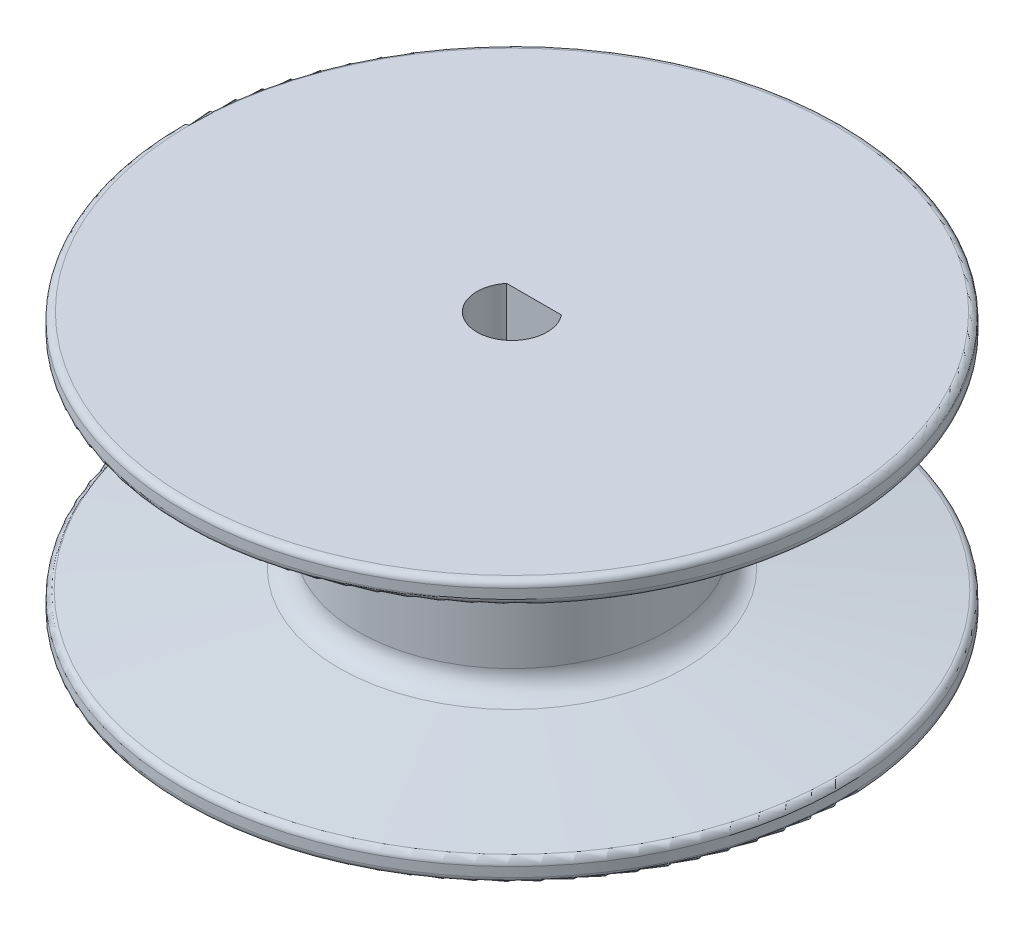
ISO-10303-21;
HEADER;
FILE_DESCRIPTION(('STEP AP214'),'2;1');
FILE_NAME('part.step','',(''),(''),'','','');
FILE_SCHEMA(('AUTOMOTIVE_DESIGN { 1 0 10303 214 1 1 1 1 }'));
ENDSEC;
DATA;
#1=APPLICATION_CONTEXT('core data for automotive mechanical design processes');
#2=APPLICATION_PROTOCOL_DEFINITION('international standard','automotive_design',2000,#1);
#3=PRODUCT_CONTEXT('',#1,'mechanical');
#4=PRODUCT('Part','Part','',(#3));
#5=PRODUCT_RELATED_PRODUCT_CATEGORY('part','',(#4));
#6=PRODUCT_DEFINITION_FORMATION('','',#4);
#7=PRODUCT_DEFINITION_CONTEXT('part definition',#1,'design');
#8=PRODUCT_DEFINITION('design','',#6,#7);
#9=PRODUCT_DEFINITION_SHAPE('','',#8);
#10=(LENGTH_UNIT() NAMED_UNIT(*) SI_UNIT(.MILLI.,.METRE.));
#11=(NAMED_UNIT(*) PLANE_ANGLE_UNIT() SI_UNIT($,.RADIAN.));
#12=(NAMED_UNIT(*) SI_UNIT($,.STERADIAN.) SOLID_ANGLE_UNIT());
#13=UNCERTAINTY_MEASURE_WITH_UNIT(LENGTH_MEASURE(1.E-05),#10,'distance_accuracy_value','');
#14=(GEOMETRIC_REPRESENTATION_CONTEXT(3) GLOBAL_UNCERTAINTY_ASSIGNED_CONTEXT((#13)) GLOBAL_UNIT_ASSIGNED_CONTEXT((#10,
#11,#12)) REPRESENTATION_CONTEXT('',''));
#15=CARTESIAN_POINT('',(0.,0.,0.));
#16=DIRECTION('',(0.,0.,1.));
#17=DIRECTION('',(1.,0.,0.));
#18=AXIS2_PLACEMENT_3D('',#15,#16,#17);
#19=CARTESIAN_POINT('',(0.,-6.,0.));
#20=DIRECTION('',(0.,-1.,0.));
#21=DIRECTION('',(0.,0.,-1.));
#22=AXIS2_PLACEMENT_3D('',#19,#20,#21);
#23=CYLINDRICAL_SURFACE('',#22,7.);
#24=CARTESIAN_POINT('',(0.,-2.88278221853732,0.));
#25=DIRECTION('',(0.,-1.,0.));
#26=DIRECTION('',(0.,0.,-1.));
#27=AXIS2_PLACEMENT_3D('',#24,#25,#26);
#28=CIRCLE('',#27,7.);
#29=CARTESIAN_POINT('',(0.,-2.88278221853732,-7.));
#30=VERTEX_POINT('',#29);
#31=EDGE_CURVE('E240',#30,#30,#28,.T.);
#32=ORIENTED_EDGE('',*,*,#31,.T.);
#33=EDGE_LOOP('',(#32));
#34=FACE_BOUND('',#33,.T.);
#35=CARTESIAN_POINT('',(0.,-9.11721778146268,0.));
#36=DIRECTION('',(0.,-1.,0.));
#37=DIRECTION('',(0.,0.,-1.));
#38=AXIS2_PLACEMENT_3D('',#35,#36,#37);
#39=CIRCLE('',#38,7.);
#40=CARTESIAN_POINT('',(0.,-9.11721778146268,-7.));
#41=VERTEX_POINT('',#40);
#42=EDGE_CURVE('E237',#41,#41,#39,.F.);
#43=ORIENTED_EDGE('',*,*,#42,.T.);
#44=EDGE_LOOP('',(#43));
#45=FACE_BOUND('',#44,.T.);
#46=CARTESIAN_POINT('',(0.,-4.25,-7.));
#47=CARTESIAN_POINT('',(0.0966887701146863,-4.25000271336119,-6.99999836512681));
#48=CARTESIAN_POINT('',(0.193407850802557,-4.25804014256942,-6.99797674487133));
#49=CARTESIAN_POINT('',(0.384074044398955,-4.28992934319151,-6.99010799468208));
#50=CARTESIAN_POINT('',(0.478019554682529,-4.31379007779416,-6.9842586965663));
#51=CARTESIAN_POINT('',(0.660357684213007,-4.37651246237244,-6.96938230720713));
#52=CARTESIAN_POINT('',(0.748756824001671,-4.41535609850116,-6.96035903315768));
#53=CARTESIAN_POINT('',(0.917784153888498,-4.50687828838564,-6.94009567775525));
#54=CARTESIAN_POINT('',(0.998412081740219,-4.55955730880543,-6.92885552163059));
#55=CARTESIAN_POINT('',(1.15126891518441,-4.67840092126325,-6.90511982523768));
#56=CARTESIAN_POINT('',(1.22331497173792,-4.74479683745238,-6.89260491673288));
#57=CARTESIAN_POINT('',(1.35537374840386,-4.8886942390604,-6.86785890137118));
#58=CARTESIAN_POINT('',(1.41538510977399,-4.96619697677091,-6.8556278266974));
#59=CARTESIAN_POINT('',(1.52253096659887,-5.13152776452701,-6.83263904982995));
#60=CARTESIAN_POINT('',(1.56946091857958,-5.21949210261214,-6.82190593549039));
#61=CARTESIAN_POINT('',(1.64779639330895,-5.40237314693475,-6.80341077280927));
#62=CARTESIAN_POINT('',(1.67920439801255,-5.49728873888006,-6.79564824951587));
#63=CARTESIAN_POINT('',(1.72498064293834,-5.68936741456955,-6.78417222837143));
#64=CARTESIAN_POINT('',(1.73967764638889,-5.78644737872477,-6.7803807292133));
#65=CARTESIAN_POINT('',(1.75263873757916,-5.98176333051631,-6.77704256294031));
#66=CARTESIAN_POINT('',(1.75090549878764,-6.07999912748171,-6.77749520523418));
#67=CARTESIAN_POINT('',(1.73131761207916,-6.27231844236856,-6.78252406412721));
#68=CARTESIAN_POINT('',(1.71385473022227,-6.36644489170928,-6.78700006835526));
#69=CARTESIAN_POINT('',(1.66392821805362,-6.55038789272984,-6.79941161289231));
#70=CARTESIAN_POINT('',(1.63146351908099,-6.64020413686715,-6.80734739965812));
#71=CARTESIAN_POINT('',(1.55212105759335,-6.81402768562741,-6.82587632888218));
#72=CARTESIAN_POINT('',(1.50510111177173,-6.89796720042115,-6.83649548714325));
#73=CARTESIAN_POINT('',(1.39808232201745,-7.05690516138298,-6.8591799598745));
#74=CARTESIAN_POINT('',(1.33808120694365,-7.1319020394118,-6.87124552723858));
#75=CARTESIAN_POINT('',(1.20477399546142,-7.2730708849768,-6.89588527296411));
#76=CARTESIAN_POINT('',(1.1311373011935,-7.33893023840491,-6.90846414390966));
#77=CARTESIAN_POINT('',(0.973713903754316,-7.45742478287456,-6.9324029317525));
#78=CARTESIAN_POINT('',(0.889926890659267,-7.51005956997416,-6.94376281140984));
#79=CARTESIAN_POINT('',(0.714135203461623,-7.60072568392845,-6.96404020776546));
#80=CARTESIAN_POINT('',(0.622103292076727,-7.63870623029683,-6.97294920149013));
#81=CARTESIAN_POINT('',(0.432688676166696,-7.6985701899945,-6.98725903156655));
#82=CARTESIAN_POINT('',(0.335306999008898,-7.72045668248783,-6.99266053895828));
#83=CARTESIAN_POINT('',(0.140629965455031,-7.74703382648531,-6.99924749149937));
#84=CARTESIAN_POINT('',(0.0433961733195777,-7.75215019708785,-7.00053729092992));
#85=CARTESIAN_POINT('',(-0.150538353935093,-7.74620949760193,-6.99905272283526));
#86=CARTESIAN_POINT('',(-0.247239136252028,-7.73515388340101,-6.99627872115488));
#87=CARTESIAN_POINT('',(-0.435883313572574,-7.69753394021006,-6.9870451131525));
#88=CARTESIAN_POINT('',(-0.527875972130214,-7.67120185927685,-6.9806407321678));
#89=CARTESIAN_POINT('',(-0.706133507861263,-7.60404173530015,-6.96486824406489));
#90=CARTESIAN_POINT('',(-0.792397805538074,-7.5632122283013,-6.95549983764874));
#91=CARTESIAN_POINT('',(-0.958443656834822,-7.46739118297948,-6.93458859247362));
#92=CARTESIAN_POINT('',(-1.03808301547514,-7.41216120220378,-6.92301011928087));
#93=CARTESIAN_POINT('',(-1.18711438258379,-7.2894117730702,-6.89901927385322));
#94=CARTESIAN_POINT('',(-1.25650461880184,-7.22189020378027,-6.88660675793655));
#95=CARTESIAN_POINT('',(-1.38482232941819,-7.07449771234813,-6.86197116454233));
#96=CARTESIAN_POINT('',(-1.44345117889237,-6.99436434649717,-6.84976021551828));
#97=CARTESIAN_POINT('',(-1.54642921884815,-6.82514525979,-6.82725024773445));
#98=CARTESIAN_POINT('',(-1.59077904318426,-6.73605993654695,-6.8169511441153));
#99=CARTESIAN_POINT('',(-1.66360999071084,-6.55194332385141,-6.79954443857109));
#100=CARTESIAN_POINT('',(-1.69218512942974,-6.45695110026532,-6.79241797840556));
#101=CARTESIAN_POINT('',(-1.73290326994608,-6.2633054224627,-6.78214534771881));
#102=CARTESIAN_POINT('',(-1.74504986539177,-6.16465277379543,-6.77899830673259));
#103=CARTESIAN_POINT('',(-1.75237835538966,-5.96952547216893,-6.77710718071283));
#104=CARTESIAN_POINT('',(-1.74803754741014,-5.87306965902115,-6.77823921516307));
#105=CARTESIAN_POINT('',(-1.72360682469834,-5.68231212988736,-6.78449227175816));
#106=CARTESIAN_POINT('',(-1.7035172264679,-5.58801037065074,-6.78961321373833));
#107=CARTESIAN_POINT('',(-1.64841987268326,-5.40475679775702,-6.80319804129843));
#108=CARTESIAN_POINT('',(-1.61350163879377,-5.31577647721976,-6.81164184442361));
#109=CARTESIAN_POINT('',(-1.52980906587258,-5.14487372016736,-6.83092381678967));
#110=CARTESIAN_POINT('',(-1.48103280503989,-5.06295226461526,-6.84176231807568));
#111=CARTESIAN_POINT('',(-1.36951237340999,-4.90618626616431,-6.86496573307431));
#112=CARTESIAN_POINT('',(-1.30643702339763,-4.83158208100538,-6.87736308970383));
#113=CARTESIAN_POINT('',(-1.16875426638802,-4.69386178107202,-6.90209365120667));
#114=CARTESIAN_POINT('',(-1.09414412480467,-4.63074839820154,-6.91442684014903));
#115=CARTESIAN_POINT('',(-0.933878851153021,-4.51668680667463,-6.93790598255607));
#116=CARTESIAN_POINT('',(-0.848048159369117,-4.46597961738316,-6.94902638926846));
#117=CARTESIAN_POINT('',(-0.668810402762221,-4.37979462656938,-6.96855745804305));
#118=CARTESIAN_POINT('',(-0.575408824009529,-4.34430591257671,-6.97697006066411));
#119=CARTESIAN_POINT('',(-0.401811962117383,-4.29483286461541,-6.98889402826465));
#120=CARTESIAN_POINT('',(-0.32244353272608,-4.27805688310433,-6.99303015894806));
#121=CARTESIAN_POINT('',(-0.162057083458997,-4.25563973244107,-6.99858372770606));
#122=CARTESIAN_POINT('',(-0.0810391881163856,-4.24999772581048,-7.00000137026043));
#123=CARTESIAN_POINT('',(0.,-4.25,-7.));
#124=B_SPLINE_CURVE_WITH_KNOTS('',3,(#46,#47,#48,#49,#50,#51,#52,#53,#54,#55,#56,#57,#58,#59,
#60,#61,#62,#63,#64,#65,#66,#67,#68,#69,#70,#71,#72,#73,#74,#75,#76,#77,#78,#79,#80,#81,#82,#83,
#84,#85,#86,#87,#88,#89,#90,#91,#92,#93,#94,#95,#96,#97,#98,#99,#100,#101,#102,#103,#104,#105,
#106,#107,#108,#109,#110,#111,#112,#113,#114,#115,#116,#117,#118,#119,#120,#121,#122,#123),
.UNSPECIFIED.,.T.,.F.,(4,2,2,2,2,2,2,2,2,2,2,2,2,2,2,2,2,2,2,2,2,2,2,2,2,2,2,2,2,2,2,2,2,2,2,2,
2,2,4),(0.,0.289769331217205,0.579702944057883,0.869289052667124,1.15888493019755,
1.45383508009995,1.74881851176739,2.04818422136775,2.34750204697596,2.64082344282669,
2.9340971113148,3.22026246508188,3.50644820710378,3.79552282519526,4.08464805975523,
4.38201751130523,4.67939604484622,4.97779600510633,5.27613885970083,5.56684693774156,
5.85752884631533,6.14390320266377,6.43030648542672,6.72179185492911,7.01332756842689,
7.31201927405222,7.61069771874426,7.90757630383043,8.20438993794476,8.49267743798381,
8.78095914448707,9.06752467319355,9.35412996159718,9.64821172478228,9.9423633139882,
10.2418421641619,10.5411059112491,10.7839928343251,11.0268614871688),.UNSPECIFIED.);
#125=CARTESIAN_POINT('',(0.,-4.25,-7.));
#126=VERTEX_POINT('',#125);
#127=EDGE_CURVE('E142',#126,#126,#124,.T.);
#128=ORIENTED_EDGE('',*,*,#127,.F.);
#129=EDGE_LOOP('',(#128));
#130=FACE_BOUND('',#129,.T.);
#131=ADVANCED_FACE('F38',(#34,#45,#130),#23,.T.);
#132=CARTESIAN_POINT('',(0.,0.,0.));
#133=DIRECTION('',(0.,-1.,0.));
#134=DIRECTION('',(0.,0.,-1.));
#135=AXIS2_PLACEMENT_3D('',#132,#133,#134);
#136=CYLINDRICAL_SURFACE('',#135,1.6);
#137=DIRECTION('',(0.,-1.,0.));
#138=VECTOR('',#137,1.);
#139=CARTESIAN_POINT('',(-1.24899959967968,0.,-1.));
#140=LINE('',#139,#138);
#141=CARTESIAN_POINT('',(-1.24899959967968,-7.22576506721313,-1.));
#142=VERTEX_POINT('',#141);
#143=CARTESIAN_POINT('',(-1.24899959967968,-12.,-1.));
#144=VERTEX_POINT('',#143);
#145=EDGE_CURVE('E223',#142,#144,#140,.T.);
#146=ORIENTED_EDGE('',*,*,#145,.F.);
#147=CARTESIAN_POINT('',(-1.24899959967968,-7.22576506721313,-1.));
#148=CARTESIAN_POINT('',(-1.27872546272438,-7.19548783157617,-0.962842567774063));
#149=CARTESIAN_POINT('',(-1.30665754424261,-7.16480922981224,-0.924590678652687));
#150=CARTESIAN_POINT('',(-1.35881979259119,-7.10350086417033,-0.846067529664403));
#151=CARTESIAN_POINT('',(-1.38307089599479,-7.07287188636127,-0.805809565178594));
#152=CARTESIAN_POINT('',(-1.42811219271172,-7.01213402453972,-0.722997046737295));
#153=CARTESIAN_POINT('',(-1.44890169674681,-6.98202524517699,-0.680442037619729));
#154=CARTESIAN_POINT('',(-1.48704406156153,-6.92328913739691,-0.592437458827899));
#155=CARTESIAN_POINT('',(-1.50437565640621,-6.89467173045152,-0.546972120003896));
#156=CARTESIAN_POINT('',(-1.51986841535707,-6.86746757864487,-0.499999999999999));
#157=B_SPLINE_CURVE_WITH_KNOTS('',3,(#147,#148,#149,#150,#151,#152,#153,#154,#155,#156),
.UNSPECIFIED.,.F.,.F.,(4,2,2,2,4),(0.,0.169146220206672,0.337291086902693,0.505469394890911,
0.674652102447786),.UNSPECIFIED.);
#158=CARTESIAN_POINT('',(-1.51986841535707,-6.86746757864487,-0.499999999999999));
#159=VERTEX_POINT('',#158);
#160=EDGE_CURVE('E105',#142,#159,#157,.T.);
#161=ORIENTED_EDGE('',*,*,#160,.T.);
#162=DIRECTION('',(0.,-1.,0.));
#163=VECTOR('',#162,1.);
#164=CARTESIAN_POINT('',(-1.51986841535707,0.,-0.499999999999999));
#165=LINE('',#164,#163);
#166=CARTESIAN_POINT('',(-1.51986841535707,-5.13253242135513,-0.499999999999999));
#167=VERTEX_POINT('',#166);
#168=EDGE_CURVE('E11',#167,#159,#165,.T.);
#169=ORIENTED_EDGE('',*,*,#168,.F.);
#170=CARTESIAN_POINT('',(-1.51986841535707,-5.13253242135513,-0.499999999999999));
#171=CARTESIAN_POINT('',(-1.50437565640621,-5.10532826954848,-0.546972120003897));
#172=CARTESIAN_POINT('',(-1.48704406156153,-5.07671086260309,-0.5924374588279));
#173=CARTESIAN_POINT('',(-1.44890169674681,-5.01797475482301,-0.680442037619729));
#174=CARTESIAN_POINT('',(-1.42811219271172,-4.98786597546028,-0.722997046737293));
#175=CARTESIAN_POINT('',(-1.38307089599479,-4.92712811363873,-0.805809565178594));
#176=CARTESIAN_POINT('',(-1.35881979259119,-4.89649913582968,-0.846067529664406));
#177=CARTESIAN_POINT('',(-1.30665754424261,-4.83519077018776,-0.924590678652684));
#178=CARTESIAN_POINT('',(-1.27872546272439,-4.80451216842381,-0.962842567774052));
#179=CARTESIAN_POINT('',(-1.24899959967971,-4.77423493278681,-0.99999999999997));
#180=B_SPLINE_CURVE_WITH_KNOTS('',3,(#170,#171,#172,#173,#174,#175,#176,#177,#178,#179),
.UNSPECIFIED.,.F.,.F.,(4,2,2,2,4),(0.,0.169182707556875,0.337361015545092,0.505505882241116,
0.674652102447786),.UNSPECIFIED.);
#181=CARTESIAN_POINT('',(-1.24899959967968,-4.77423493278687,-1.));
#182=VERTEX_POINT('',#181);
#183=EDGE_CURVE('E103',#167,#182,#180,.T.);
#184=ORIENTED_EDGE('',*,*,#183,.T.);
#185=CARTESIAN_POINT('',(-1.24899959967968,0.,-1.));
#186=VERTEX_POINT('',#185);
#187=EDGE_CURVE('E229',#186,#182,#140,.T.);
#188=ORIENTED_EDGE('',*,*,#187,.F.);
#189=CARTESIAN_POINT('',(0.,0.,0.));
#190=DIRECTION('',(0.,1.,0.));
#191=DIRECTION('',(0.,0.,1.));
#192=AXIS2_PLACEMENT_3D('',#189,#190,#191);
#193=CIRCLE('',#192,1.6);
#194=CARTESIAN_POINT('',(1.24899959967968,0.,-1.));
#195=VERTEX_POINT('',#194);
#196=EDGE_CURVE('E150',#186,#195,#193,.T.);
#197=ORIENTED_EDGE('',*,*,#196,.T.);
#198=DIRECTION('',(0.,-1.,0.));
#199=VECTOR('',#198,1.);
#200=CARTESIAN_POINT('',(1.24899959967968,0.,-1.));
#201=LINE('',#200,#199);
#202=CARTESIAN_POINT('',(1.24899959967968,-4.77423493278687,-1.));
#203=VERTEX_POINT('',#202);
#204=EDGE_CURVE('E60',#195,#203,#201,.T.);
#205=ORIENTED_EDGE('',*,*,#204,.T.);
#206=CARTESIAN_POINT('',(1.24899959967968,-4.77423493278688,-1.));
#207=CARTESIAN_POINT('',(1.27872546272438,-4.80451216842384,-0.962842567774063));
#208=CARTESIAN_POINT('',(1.30665754424261,-4.83519077018776,-0.924590678652686));
#209=CARTESIAN_POINT('',(1.35881979259119,-4.89649913582967,-0.846067529664402));
#210=CARTESIAN_POINT('',(1.38307089599479,-4.92712811363873,-0.805809565178593));
#211=CARTESIAN_POINT('',(1.42811219271172,-4.98786597546028,-0.722997046737294));
#212=CARTESIAN_POINT('',(1.44890169674681,-5.01797475482301,-0.680442037619729));
#213=CARTESIAN_POINT('',(1.48704406156153,-5.07671086260309,-0.592437458827899));
#214=CARTESIAN_POINT('',(1.50437565640621,-5.10532826954848,-0.546972120003896));
#215=CARTESIAN_POINT('',(1.51986841535707,-5.13253242135513,-0.499999999999999));
#216=B_SPLINE_CURVE_WITH_KNOTS('',3,(#206,#207,#208,#209,#210,#211,#212,#213,#214,#215),
.UNSPECIFIED.,.F.,.F.,(4,2,2,2,4),(0.,0.16914622020667,0.337291086902693,0.50546939489091,
0.674652102447785),.UNSPECIFIED.);
#217=CARTESIAN_POINT('',(1.51986841535707,-5.13253242135513,-0.499999999999999));
#218=VERTEX_POINT('',#217);
#219=EDGE_CURVE('E53',#203,#218,#216,.T.);
#220=ORIENTED_EDGE('',*,*,#219,.T.);
#221=DIRECTION('',(0.,-1.,0.));
#222=VECTOR('',#221,1.);
#223=CARTESIAN_POINT('',(1.51986841535707,0.,-0.499999999999999));
#224=LINE('',#223,#222);
#225=CARTESIAN_POINT('',(1.51986841535707,-6.86746757864487,-0.499999999999999));
#226=VERTEX_POINT('',#225);
#227=EDGE_CURVE('E46',#226,#218,#224,.F.);
#228=ORIENTED_EDGE('',*,*,#227,.F.);
#229=CARTESIAN_POINT('',(1.51986841535707,-6.86746757864487,-0.499999999999999));
#230=CARTESIAN_POINT('',(1.50437565640621,-6.89467173045152,-0.546972120003897));
#231=CARTESIAN_POINT('',(1.48704406156153,-6.92328913739691,-0.592437458827899));
#232=CARTESIAN_POINT('',(1.44890169674681,-6.98202524517699,-0.680442037619729));
#233=CARTESIAN_POINT('',(1.42811219271172,-7.01213402453972,-0.722997046737294));
#234=CARTESIAN_POINT('',(1.38307089599479,-7.07287188636127,-0.805809565178595));
#235=CARTESIAN_POINT('',(1.35881979259119,-7.10350086417032,-0.846067529664407));
#236=CARTESIAN_POINT('',(1.30665754424261,-7.16480922981225,-0.924590678652685));
#237=CARTESIAN_POINT('',(1.27872546272439,-7.19548783157619,-0.962842567774053));
#238=CARTESIAN_POINT('',(1.24899959967971,-7.2257650672132,-0.999999999999971));
#239=B_SPLINE_CURVE_WITH_KNOTS('',3,(#229,#230,#231,#232,#233,#234,#235,#236,#237,#238),
.UNSPECIFIED.,.F.,.F.,(4,2,2,2,4),(0.,0.169182707556875,0.337361015545093,0.505505882241117,
0.674652102447788),.UNSPECIFIED.);
#240=CARTESIAN_POINT('',(1.24899959967968,-7.22576506721313,-1.));
#241=VERTEX_POINT('',#240);
#242=EDGE_CURVE('E98',#226,#241,#239,.T.);
#243=ORIENTED_EDGE('',*,*,#242,.T.);
#244=CARTESIAN_POINT('',(1.24899959967968,-12.,-1.));
#245=VERTEX_POINT('',#244);
#246=EDGE_CURVE('E225',#241,#245,#201,.T.);
#247=ORIENTED_EDGE('',*,*,#246,.T.);
#248=CARTESIAN_POINT('',(0.,-12.,0.));
#249=DIRECTION('',(0.,1.,0.));
#250=DIRECTION('',(0.,0.,1.));
#251=AXIS2_PLACEMENT_3D('',#248,#249,#250);
#252=CIRCLE('',#251,1.6);
#253=EDGE_CURVE('E149',#144,#245,#252,.T.);
#254=ORIENTED_EDGE('',*,*,#253,.F.);
#255=EDGE_LOOP('',(#146,#161,#169,#184,#188,#197,#205,#220,#228,#243,#247,#254));
#256=FACE_BOUND('',#255,.T.);
#257=ADVANCED_FACE('F102',(#256),#136,.F.);
#258=CARTESIAN_POINT('',(0.,0.,-1.));
#259=DIRECTION('',(0.,0.,1.));
#260=DIRECTION('',(1.,0.,0.));
#261=AXIS2_PLACEMENT_3D('',#258,#259,#260);
#262=PLANE('',#261);
#263=ORIENTED_EDGE('',*,*,#246,.F.);
#264=CARTESIAN_POINT('',(0.,-6.,-1.));
#265=DIRECTION('',(0.,0.,1.));
#266=DIRECTION('',(1.,0.,0.));
#267=AXIS2_PLACEMENT_3D('',#264,#265,#266);
#268=CIRCLE('',#267,1.75);
#269=EDGE_CURVE('E95',#241,#142,#268,.F.);
#270=ORIENTED_EDGE('',*,*,#269,.T.);
#271=ORIENTED_EDGE('',*,*,#145,.T.);
#272=DIRECTION('',(-1.,0.,0.));
#273=VECTOR('',#272,1.);
#274=CARTESIAN_POINT('',(0.,-12.,-1.));
#275=LINE('',#274,#273);
#276=EDGE_CURVE('E234',#245,#144,#275,.T.);
#277=ORIENTED_EDGE('',*,*,#276,.F.);
#278=EDGE_LOOP('',(#263,#270,#271,#277));
#279=FACE_BOUND('',#278,.T.);
#280=ADVANCED_FACE('F171',(#279),#262,.T.);
#281=CARTESIAN_POINT('',(0.,0.,0.));
#282=DIRECTION('',(0.,-1.,0.));
#283=DIRECTION('',(0.,0.,-1.));
#284=AXIS2_PLACEMENT_3D('',#281,#282,#283);
#285=PLANE('',#284);
#286=CARTESIAN_POINT('',(0.,0.,0.));
#287=DIRECTION('',(0.,-1.,0.));
#288=DIRECTION('',(0.,0.,-1.));
#289=AXIS2_PLACEMENT_3D('',#286,#287,#288);
#290=CIRCLE('',#289,14.7);
#291=CARTESIAN_POINT('',(0.,0.,-14.7));
#292=VERTEX_POINT('',#291);
#293=EDGE_CURVE('E198',#292,#292,#290,.F.);
#294=ORIENTED_EDGE('',*,*,#293,.T.);
#295=EDGE_LOOP('',(#294));
#296=FACE_BOUND('',#295,.T.);
#297=ORIENTED_EDGE('',*,*,#196,.F.);
#298=DIRECTION('',(-1.,0.,0.));
#299=VECTOR('',#298,1.);
#300=CARTESIAN_POINT('',(0.,0.,-1.));
#301=LINE('',#300,#299);
#302=EDGE_CURVE('E230',#195,#186,#301,.T.);
#303=ORIENTED_EDGE('',*,*,#302,.F.);
#304=EDGE_LOOP('',(#297,#303));
#305=FACE_BOUND('',#304,.T.);
#306=ADVANCED_FACE('F168',(#296,#305),#285,.F.);
#307=CARTESIAN_POINT('',(0.,-12.,0.));
#308=DIRECTION('',(0.,1.,0.));
#309=DIRECTION('',(0.,0.,-1.));
#310=AXIS2_PLACEMENT_3D('',#307,#308,#309);
#311=PLANE('',#310);
#312=CARTESIAN_POINT('',(0.,-12.,0.));
#313=DIRECTION('',(0.,1.,0.));
#314=DIRECTION('',(0.,0.,1.));
#315=AXIS2_PLACEMENT_3D('',#312,#313,#314);
#316=CIRCLE('',#315,14.7);
#317=CARTESIAN_POINT('',(0.,-12.,14.7));
#318=VERTEX_POINT('',#317);
#319=EDGE_CURVE('E249',#318,#318,#316,.F.);
#320=ORIENTED_EDGE('',*,*,#319,.T.);
#321=EDGE_LOOP('',(#320));
#322=FACE_BOUND('',#321,.T.);
#323=ORIENTED_EDGE('',*,*,#253,.T.);
#324=ORIENTED_EDGE('',*,*,#276,.T.);
#325=EDGE_LOOP('',(#323,#324));
#326=FACE_BOUND('',#325,.T.);
#327=ADVANCED_FACE('F157',(#322,#326),#311,.F.);
#328=CARTESIAN_POINT('',(0.,-6.,0.));
#329=DIRECTION('',(0.,-1.,0.));
#330=DIRECTION('',(0.,0.,-1.));
#331=AXIS2_PLACEMENT_3D('',#328,#329,#330);
#332=CYLINDRICAL_SURFACE('',#331,15.);
#333=CARTESIAN_POINT('',(0.,-0.735165334438806,0.));
#334=DIRECTION('',(0.,1.,0.));
#335=DIRECTION('',(0.,0.,1.));
#336=AXIS2_PLACEMENT_3D('',#333,#334,#335);
#337=CIRCLE('',#336,15.);
#338=CARTESIAN_POINT('',(0.,-0.735165334438806,15.));
#339=VERTEX_POINT('',#338);
#340=EDGE_CURVE('E203',#339,#339,#337,.T.);
#341=ORIENTED_EDGE('',*,*,#340,.T.);
#342=EDGE_LOOP('',(#341));
#343=FACE_BOUND('',#342,.T.);
#344=CARTESIAN_POINT('',(0.,-0.300000000000001,0.));
#345=DIRECTION('',(0.,-1.,0.));
#346=DIRECTION('',(0.,0.,-1.));
#347=AXIS2_PLACEMENT_3D('',#344,#345,#346);
#348=CIRCLE('',#347,15.);
#349=CARTESIAN_POINT('',(0.,-0.300000000000001,-15.));
#350=VERTEX_POINT('',#349);
#351=EDGE_CURVE('E201',#350,#350,#348,.T.);
#352=ORIENTED_EDGE('',*,*,#351,.T.);
#353=EDGE_LOOP('',(#352));
#354=FACE_BOUND('',#353,.T.);
#355=ADVANCED_FACE('F163',(#343,#354),#332,.T.);
#356=CARTESIAN_POINT('',(0.,-1.,0.));
#357=DIRECTION('',(0.,1.,0.));
#358=DIRECTION('',(0.,0.,1.));
#359=AXIS2_PLACEMENT_3D('',#356,#357,#358);
#360=CONICAL_SURFACE('',#359,15.,1.44644133224814);
#361=CARTESIAN_POINT('',(0.,-1.03284869745291,0.));
#362=DIRECTION('',(0.,-1.,0.));
#363=DIRECTION('',(0.,0.,-1.));
#364=AXIS2_PLACEMENT_3D('',#361,#362,#363);
#365=CIRCLE('',#364,14.7372104203768);
#366=CARTESIAN_POINT('',(0.,-1.03284869745291,-14.7372104203768));
#367=VERTEX_POINT('',#366);
#368=EDGE_CURVE('E204',#367,#367,#365,.T.);
#369=ORIENTED_EDGE('',*,*,#368,.T.);
#370=EDGE_LOOP('',(#369));
#371=FACE_BOUND('',#370,.T.);
#372=CARTESIAN_POINT('',(0.,-1.89050434182366,0.));
#373=DIRECTION('',(0.,1.,0.));
#374=DIRECTION('',(0.,0.,1.));
#375=AXIS2_PLACEMENT_3D('',#372,#373,#374);
#376=CIRCLE('',#375,7.87596526541079);
#377=CARTESIAN_POINT('',(0.,-1.89050434182366,7.87596526541079));
#378=VERTEX_POINT('',#377);
#379=EDGE_CURVE('E243',#378,#378,#376,.T.);
#380=ORIENTED_EDGE('',*,*,#379,.T.);
#381=EDGE_LOOP('',(#380));
#382=FACE_BOUND('',#381,.T.);
#383=ADVANCED_FACE('F159',(#371,#382),#360,.T.);
#384=CARTESIAN_POINT('',(0.,-6.,0.));
#385=DIRECTION('',(0.,1.,0.));
#386=DIRECTION('',(0.,0.,-1.));
#387=AXIS2_PLACEMENT_3D('',#384,#385,#386);
#388=CYLINDRICAL_SURFACE('',#387,15.);
#389=CARTESIAN_POINT('',(0.,-11.7,0.));
#390=DIRECTION('',(0.,1.,0.));
#391=DIRECTION('',(0.,0.,1.));
#392=AXIS2_PLACEMENT_3D('',#389,#390,#391);
#393=CIRCLE('',#392,15.);
#394=CARTESIAN_POINT('',(0.,-11.7,15.));
#395=VERTEX_POINT('',#394);
#396=EDGE_CURVE('E209',#395,#395,#393,.T.);
#397=ORIENTED_EDGE('',*,*,#396,.T.);
#398=EDGE_LOOP('',(#397));
#399=FACE_BOUND('',#398,.T.);
#400=CARTESIAN_POINT('',(0.,-11.2648346655612,0.));
#401=DIRECTION('',(0.,1.,0.));
#402=DIRECTION('',(0.,0.,1.));
#403=AXIS2_PLACEMENT_3D('',#400,#401,#402);
#404=CIRCLE('',#403,15.);
#405=CARTESIAN_POINT('',(0.,-11.2648346655612,15.));
#406=VERTEX_POINT('',#405);
#407=EDGE_CURVE('E252',#406,#406,#404,.F.);
#408=ORIENTED_EDGE('',*,*,#407,.T.);
#409=EDGE_LOOP('',(#408));
#410=FACE_BOUND('',#409,.T.);
#411=ADVANCED_FACE('F162',(#399,#410),#388,.T.);
#412=CARTESIAN_POINT('',(0.,-11.,0.));
#413=DIRECTION('',(0.,-1.,0.));
#414=DIRECTION('',(0.,0.,1.));
#415=AXIS2_PLACEMENT_3D('',#412,#413,#414);
#416=CONICAL_SURFACE('',#415,15.,1.44644133224814);
#417=CARTESIAN_POINT('',(0.,-10.9671513025471,0.));
#418=DIRECTION('',(0.,1.,0.));
#419=DIRECTION('',(0.,0.,1.));
#420=AXIS2_PLACEMENT_3D('',#417,#418,#419);
#421=CIRCLE('',#420,14.7372104203768);
#422=CARTESIAN_POINT('',(0.,-10.9671513025471,14.7372104203768));
#423=VERTEX_POINT('',#422);
#424=EDGE_CURVE('E214',#423,#423,#421,.T.);
#425=ORIENTED_EDGE('',*,*,#424,.T.);
#426=EDGE_LOOP('',(#425));
#427=FACE_BOUND('',#426,.T.);
#428=CARTESIAN_POINT('',(0.,-10.1094956581763,0.));
#429=DIRECTION('',(0.,-1.,0.));
#430=DIRECTION('',(0.,0.,-1.));
#431=AXIS2_PLACEMENT_3D('',#428,#429,#430);
#432=CIRCLE('',#431,7.87596526541079);
#433=CARTESIAN_POINT('',(0.,-10.1094956581763,-7.87596526541079));
#434=VERTEX_POINT('',#433);
#435=EDGE_CURVE('E246',#434,#434,#432,.T.);
#436=ORIENTED_EDGE('',*,*,#435,.T.);
#437=EDGE_LOOP('',(#436));
#438=FACE_BOUND('',#437,.T.);
#439=ADVANCED_FACE('F268',(#427,#438),#416,.T.);
#440=ORIENTED_EDGE('',*,*,#187,.T.);
#441=EDGE_CURVE('E217',#182,#203,#268,.F.);
#442=ORIENTED_EDGE('',*,*,#441,.T.);
#443=ORIENTED_EDGE('',*,*,#204,.F.);
#444=ORIENTED_EDGE('',*,*,#302,.T.);
#445=EDGE_LOOP('',(#440,#442,#443,#444));
#446=FACE_BOUND('',#445,.T.);
#447=ADVANCED_FACE('F131',(#446),#262,.T.);
#448=CARTESIAN_POINT('',(0.,-2.88278221853732,0.));
#449=DIRECTION('',(0.,-1.,0.));
#450=DIRECTION('',(0.,0.,-1.));
#451=AXIS2_PLACEMENT_3D('',#448,#449,#450);
#452=TOROIDAL_SURFACE('',#451,8.,1.);
#453=ORIENTED_EDGE('',*,*,#379,.F.);
#454=EDGE_LOOP('',(#453));
#455=FACE_BOUND('',#454,.T.);
#456=ORIENTED_EDGE('',*,*,#31,.F.);
#457=EDGE_LOOP('',(#456));
#458=FACE_BOUND('',#457,.T.);
#459=ADVANCED_FACE('F173',(#455,#458),#452,.F.);
#460=CARTESIAN_POINT('',(0.,-9.11721778146268,0.));
#461=DIRECTION('',(0.,-1.,0.));
#462=DIRECTION('',(0.,0.,-1.));
#463=AXIS2_PLACEMENT_3D('',#460,#461,#462);
#464=TOROIDAL_SURFACE('',#463,8.,1.);
#465=ORIENTED_EDGE('',*,*,#42,.F.);
#466=EDGE_LOOP('',(#465));
#467=FACE_BOUND('',#466,.T.);
#468=ORIENTED_EDGE('',*,*,#435,.F.);
#469=EDGE_LOOP('',(#468));
#470=FACE_BOUND('',#469,.T.);
#471=ADVANCED_FACE('F176',(#467,#470),#464,.F.);
#472=CARTESIAN_POINT('',(0.,-11.7,0.));
#473=DIRECTION('',(0.,1.,0.));
#474=DIRECTION('',(0.,0.,1.));
#475=AXIS2_PLACEMENT_3D('',#472,#473,#474);
#476=TOROIDAL_SURFACE('',#475,14.7,0.3);
#477=ORIENTED_EDGE('',*,*,#396,.F.);
#478=EDGE_LOOP('',(#477));
#479=FACE_BOUND('',#478,.T.);
#480=ORIENTED_EDGE('',*,*,#319,.F.);
#481=EDGE_LOOP('',(#480));
#482=FACE_BOUND('',#481,.T.);
#483=ADVANCED_FACE('F180',(#479,#482),#476,.T.);
#484=CARTESIAN_POINT('',(0.,-0.735165334438806,0.));
#485=DIRECTION('',(0.,1.,0.));
#486=DIRECTION('',(0.,0.,1.));
#487=AXIS2_PLACEMENT_3D('',#484,#485,#486);
#488=TOROIDAL_SURFACE('',#487,14.7,0.3);
#489=ORIENTED_EDGE('',*,*,#340,.F.);
#490=EDGE_LOOP('',(#489));
#491=FACE_BOUND('',#490,.T.);
#492=ORIENTED_EDGE('',*,*,#368,.F.);
#493=EDGE_LOOP('',(#492));
#494=FACE_BOUND('',#493,.T.);
#495=ADVANCED_FACE('F184',(#491,#494),#488,.T.);
#496=CARTESIAN_POINT('',(0.,-0.300000000000001,0.));
#497=DIRECTION('',(0.,-1.,0.));
#498=DIRECTION('',(0.,0.,-1.));
#499=AXIS2_PLACEMENT_3D('',#496,#497,#498);
#500=TOROIDAL_SURFACE('',#499,14.7,0.3);
#501=ORIENTED_EDGE('',*,*,#293,.F.);
#502=EDGE_LOOP('',(#501));
#503=FACE_BOUND('',#502,.T.);
#504=ORIENTED_EDGE('',*,*,#351,.F.);
#505=EDGE_LOOP('',(#504));
#506=FACE_BOUND('',#505,.T.);
#507=ADVANCED_FACE('F187',(#503,#506),#500,.T.);
#508=CARTESIAN_POINT('',(0.,-11.2648346655612,0.));
#509=DIRECTION('',(0.,1.,0.));
#510=DIRECTION('',(0.,0.,1.));
#511=AXIS2_PLACEMENT_3D('',#508,#509,#510);
#512=TOROIDAL_SURFACE('',#511,14.7,0.3);
#513=ORIENTED_EDGE('',*,*,#424,.F.);
#514=EDGE_LOOP('',(#513));
#515=FACE_BOUND('',#514,.T.);
#516=ORIENTED_EDGE('',*,*,#407,.F.);
#517=EDGE_LOOP('',(#516));
#518=FACE_BOUND('',#517,.T.);
#519=ADVANCED_FACE('F40',(#515,#518),#512,.T.);
#520=CARTESIAN_POINT('',(0.,0.,-0.499999999999999));
#521=DIRECTION('',(0.,0.,1.));
#522=DIRECTION('',(1.,0.,0.));
#523=AXIS2_PLACEMENT_3D('',#520,#521,#522);
#524=PLANE('',#523);
#525=ORIENTED_EDGE('',*,*,#168,.T.);
#526=CARTESIAN_POINT('',(0.,-6.,-0.499999999999999));
#527=DIRECTION('',(0.,0.,1.));
#528=DIRECTION('',(1.,0.,0.));
#529=AXIS2_PLACEMENT_3D('',#526,#527,#528);
#530=CIRCLE('',#529,1.75);
#531=EDGE_CURVE('E99',#167,#159,#530,.T.);
#532=ORIENTED_EDGE('',*,*,#531,.F.);
#533=EDGE_LOOP('',(#525,#532));
#534=FACE_BOUND('',#533,.T.);
#535=ADVANCED_FACE('F130',(#534),#524,.F.);
#536=CARTESIAN_POINT('',(0.,-6.,-0.499999999999999));
#537=DIRECTION('',(0.,0.,-1.));
#538=DIRECTION('',(-1.,0.,0.));
#539=AXIS2_PLACEMENT_3D('',#536,#537,#538);
#540=CYLINDRICAL_SURFACE('',#539,1.75);
#541=ORIENTED_EDGE('',*,*,#269,.F.);
#542=ORIENTED_EDGE('',*,*,#242,.F.);
#543=EDGE_CURVE('E92',#226,#218,#530,.T.);
#544=ORIENTED_EDGE('',*,*,#543,.T.);
#545=ORIENTED_EDGE('',*,*,#219,.F.);
#546=ORIENTED_EDGE('',*,*,#441,.F.);
#547=ORIENTED_EDGE('',*,*,#183,.F.);
#548=ORIENTED_EDGE('',*,*,#531,.T.);
#549=ORIENTED_EDGE('',*,*,#160,.F.);
#550=EDGE_LOOP('',(#541,#542,#544,#545,#546,#547,#548,#549));
#551=FACE_BOUND('',#550,.T.);
#552=ORIENTED_EDGE('',*,*,#127,.T.);
#553=EDGE_LOOP('',(#552));
#554=FACE_BOUND('',#553,.T.);
#555=ADVANCED_FACE('F96',(#551,#554),#540,.F.);
#556=ORIENTED_EDGE('',*,*,#227,.T.);
#557=ORIENTED_EDGE('',*,*,#543,.F.);
#558=EDGE_LOOP('',(#556,#557));
#559=FACE_BOUND('',#558,.T.);
#560=ADVANCED_FACE('F91',(#559),#524,.F.);
#561=CLOSED_SHELL('',(#131,#257,#280,#306,#327,#355,#383,#411,#439,#447,#459,#471,#483,#495,
#507,#519,#535,#555,#560));
#562=MANIFOLD_SOLID_BREP('B2',#561);
#563=ADVANCED_BREP_SHAPE_REPRESENTATION('',(#18,#562),#14);
#564=SHAPE_DEFINITION_REPRESENTATION(#9,#563);
ENDSEC;
END-ISO-10303-21;
